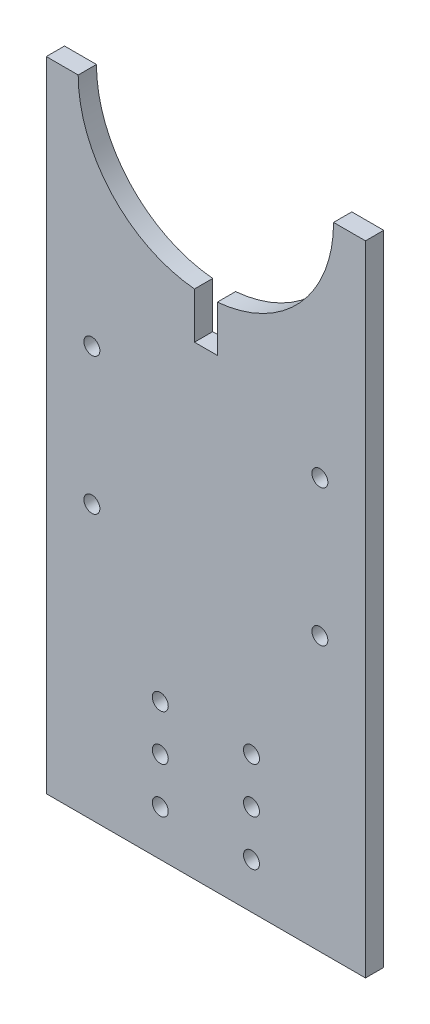
ISO-10303-21;
HEADER;
FILE_DESCRIPTION(('STEP AP214'),'2;1');
FILE_NAME('part.step','',(''),(''),'','','');
FILE_SCHEMA(('AUTOMOTIVE_DESIGN { 1 0 10303 214 1 1 1 1 }'));
ENDSEC;
DATA;
#1=APPLICATION_CONTEXT('core data for automotive mechanical design processes');
#2=APPLICATION_PROTOCOL_DEFINITION('international standard','automotive_design',2000,#1);
#3=PRODUCT_CONTEXT('',#1,'mechanical');
#4=PRODUCT('Part','Part','',(#3));
#5=PRODUCT_RELATED_PRODUCT_CATEGORY('part','',(#4));
#6=PRODUCT_DEFINITION_FORMATION('','',#4);
#7=PRODUCT_DEFINITION_CONTEXT('part definition',#1,'design');
#8=PRODUCT_DEFINITION('design','',#6,#7);
#9=PRODUCT_DEFINITION_SHAPE('','',#8);
#10=(LENGTH_UNIT() NAMED_UNIT(*) SI_UNIT(.MILLI.,.METRE.));
#11=(NAMED_UNIT(*) PLANE_ANGLE_UNIT() SI_UNIT($,.RADIAN.));
#12=(NAMED_UNIT(*) SI_UNIT($,.STERADIAN.) SOLID_ANGLE_UNIT());
#13=UNCERTAINTY_MEASURE_WITH_UNIT(LENGTH_MEASURE(1.E-05),#10,'distance_accuracy_value','');
#14=(GEOMETRIC_REPRESENTATION_CONTEXT(3) GLOBAL_UNCERTAINTY_ASSIGNED_CONTEXT((#13)) GLOBAL_UNIT_ASSIGNED_CONTEXT((#10,
#11,#12)) REPRESENTATION_CONTEXT('',''));
#15=CARTESIAN_POINT('',(0.,0.,0.));
#16=DIRECTION('',(0.,0.,1.));
#17=DIRECTION('',(1.,0.,0.));
#18=AXIS2_PLACEMENT_3D('',#15,#16,#17);
#19=CARTESIAN_POINT('',(0.,140.,0.));
#20=DIRECTION('',(0.,0.,1.));
#21=DIRECTION('',(1.,0.,0.));
#22=AXIS2_PLACEMENT_3D('',#19,#20,#21);
#23=PLANE('',#22);
#24=CARTESIAN_POINT('',(25.,90.,0.));
#25=DIRECTION('',(0.,0.,-1.));
#26=DIRECTION('',(-1.,0.,0.));
#27=AXIS2_PLACEMENT_3D('',#24,#25,#26);
#28=CIRCLE('',#27,1.75);
#29=CARTESIAN_POINT('',(23.25,90.,0.));
#30=VERTEX_POINT('',#29);
#31=EDGE_CURVE('E401',#30,#30,#28,.T.);
#32=ORIENTED_EDGE('',*,*,#31,.F.);
#33=EDGE_LOOP('',(#32));
#34=FACE_BOUND('',#33,.T.);
#35=CARTESIAN_POINT('',(-25.,90.,0.));
#36=DIRECTION('',(0.,0.,-1.));
#37=DIRECTION('',(-1.,0.,0.));
#38=AXIS2_PLACEMENT_3D('',#35,#36,#37);
#39=CIRCLE('',#38,1.75);
#40=CARTESIAN_POINT('',(-26.75,90.,0.));
#41=VERTEX_POINT('',#40);
#42=EDGE_CURVE('E393',#41,#41,#39,.T.);
#43=ORIENTED_EDGE('',*,*,#42,.F.);
#44=EDGE_LOOP('',(#43));
#45=FACE_BOUND('',#44,.T.);
#46=CARTESIAN_POINT('',(10.,30.,0.));
#47=DIRECTION('',(0.,0.,1.));
#48=DIRECTION('',(1.,0.,0.));
#49=AXIS2_PLACEMENT_3D('',#46,#47,#48);
#50=CIRCLE('',#49,1.75);
#51=CARTESIAN_POINT('',(11.75,30.,0.));
#52=VERTEX_POINT('',#51);
#53=EDGE_CURVE('E217',#52,#52,#50,.T.);
#54=ORIENTED_EDGE('',*,*,#53,.T.);
#55=EDGE_LOOP('',(#54));
#56=FACE_BOUND('',#55,.T.);
#57=CARTESIAN_POINT('',(-10.,30.,0.));
#58=DIRECTION('',(0.,0.,1.));
#59=DIRECTION('',(1.,0.,0.));
#60=AXIS2_PLACEMENT_3D('',#57,#58,#59);
#61=CIRCLE('',#60,1.75);
#62=CARTESIAN_POINT('',(-8.25,30.,0.));
#63=VERTEX_POINT('',#62);
#64=EDGE_CURVE('E225',#63,#63,#61,.T.);
#65=ORIENTED_EDGE('',*,*,#64,.T.);
#66=EDGE_LOOP('',(#65));
#67=FACE_BOUND('',#66,.T.);
#68=CARTESIAN_POINT('',(10.,20.,0.));
#69=DIRECTION('',(0.,0.,1.));
#70=DIRECTION('',(1.,0.,0.));
#71=AXIS2_PLACEMENT_3D('',#68,#69,#70);
#72=CIRCLE('',#71,1.75);
#73=CARTESIAN_POINT('',(11.75,20.,0.));
#74=VERTEX_POINT('',#73);
#75=EDGE_CURVE('E233',#74,#74,#72,.T.);
#76=ORIENTED_EDGE('',*,*,#75,.T.);
#77=EDGE_LOOP('',(#76));
#78=FACE_BOUND('',#77,.T.);
#79=CARTESIAN_POINT('',(-10.,10.,0.));
#80=DIRECTION('',(0.,0.,1.));
#81=DIRECTION('',(1.,0.,0.));
#82=AXIS2_PLACEMENT_3D('',#79,#80,#81);
#83=CIRCLE('',#82,1.75);
#84=CARTESIAN_POINT('',(-8.25,10.,0.));
#85=VERTEX_POINT('',#84);
#86=EDGE_CURVE('E241',#85,#85,#83,.T.);
#87=ORIENTED_EDGE('',*,*,#86,.T.);
#88=EDGE_LOOP('',(#87));
#89=FACE_BOUND('',#88,.T.);
#90=CARTESIAN_POINT('',(-10.,20.,0.));
#91=DIRECTION('',(0.,0.,1.));
#92=DIRECTION('',(1.,0.,0.));
#93=AXIS2_PLACEMENT_3D('',#90,#91,#92);
#94=CIRCLE('',#93,1.75);
#95=CARTESIAN_POINT('',(-8.25,20.,0.));
#96=VERTEX_POINT('',#95);
#97=EDGE_CURVE('E249',#96,#96,#94,.T.);
#98=ORIENTED_EDGE('',*,*,#97,.T.);
#99=EDGE_LOOP('',(#98));
#100=FACE_BOUND('',#99,.T.);
#101=CARTESIAN_POINT('',(10.,10.,0.));
#102=DIRECTION('',(0.,0.,1.));
#103=DIRECTION('',(1.,0.,0.));
#104=AXIS2_PLACEMENT_3D('',#101,#102,#103);
#105=CIRCLE('',#104,1.75);
#106=CARTESIAN_POINT('',(11.75,10.,0.));
#107=VERTEX_POINT('',#106);
#108=EDGE_CURVE('E257',#107,#107,#105,.T.);
#109=ORIENTED_EDGE('',*,*,#108,.T.);
#110=EDGE_LOOP('',(#109));
#111=FACE_BOUND('',#110,.T.);
#112=CARTESIAN_POINT('',(25.,60.,0.));
#113=DIRECTION('',(0.,0.,1.));
#114=DIRECTION('',(1.,0.,0.));
#115=AXIS2_PLACEMENT_3D('',#112,#113,#114);
#116=CIRCLE('',#115,1.75);
#117=CARTESIAN_POINT('',(26.75,60.,0.));
#118=VERTEX_POINT('',#117);
#119=EDGE_CURVE('E265',#118,#118,#116,.T.);
#120=ORIENTED_EDGE('',*,*,#119,.T.);
#121=EDGE_LOOP('',(#120));
#122=FACE_BOUND('',#121,.T.);
#123=CARTESIAN_POINT('',(-25.,60.,0.));
#124=DIRECTION('',(0.,0.,1.));
#125=DIRECTION('',(1.,0.,0.));
#126=AXIS2_PLACEMENT_3D('',#123,#124,#125);
#127=CIRCLE('',#126,1.75);
#128=CARTESIAN_POINT('',(-23.25,60.,0.));
#129=VERTEX_POINT('',#128);
#130=EDGE_CURVE('E273',#129,#129,#127,.T.);
#131=ORIENTED_EDGE('',*,*,#130,.T.);
#132=EDGE_LOOP('',(#131));
#133=FACE_BOUND('',#132,.T.);
#134=DIRECTION('',(-1.,0.,0.));
#135=VECTOR('',#134,1.);
#136=CARTESIAN_POINT('',(2.5,102.,0.));
#137=LINE('',#136,#135);
#138=CARTESIAN_POINT('',(2.5,102.,0.));
#139=VERTEX_POINT('',#138);
#140=CARTESIAN_POINT('',(-2.5,102.,0.));
#141=VERTEX_POINT('',#140);
#142=EDGE_CURVE('E208',#139,#141,#137,.T.);
#143=ORIENTED_EDGE('',*,*,#142,.F.);
#144=DIRECTION('',(0.,-1.,0.));
#145=VECTOR('',#144,1.);
#146=CARTESIAN_POINT('',(2.5,140.,0.));
#147=LINE('',#146,#145);
#148=CARTESIAN_POINT('',(2.5,112.111830465231,0.));
#149=VERTEX_POINT('',#148);
#150=EDGE_CURVE('E191',#149,#139,#147,.T.);
#151=ORIENTED_EDGE('',*,*,#150,.F.);
#152=CARTESIAN_POINT('',(0.,140.,0.));
#153=DIRECTION('',(0.,0.,-1.));
#154=DIRECTION('',(1.,0.,0.));
#155=AXIS2_PLACEMENT_3D('',#152,#153,#154);
#156=CIRCLE('',#155,28.);
#157=CARTESIAN_POINT('',(28.,140.,0.));
#158=VERTEX_POINT('',#157);
#159=EDGE_CURVE('E321',#158,#149,#156,.T.);
#160=ORIENTED_EDGE('',*,*,#159,.F.);
#161=DIRECTION('',(-1.,0.,0.));
#162=VECTOR('',#161,1.);
#163=CARTESIAN_POINT('',(28.,140.,0.));
#164=LINE('',#163,#162);
#165=CARTESIAN_POINT('',(35.,140.,0.));
#166=VERTEX_POINT('',#165);
#167=EDGE_CURVE('E317',#166,#158,#164,.T.);
#168=ORIENTED_EDGE('',*,*,#167,.F.);
#169=DIRECTION('',(0.,1.,0.));
#170=VECTOR('',#169,1.);
#171=CARTESIAN_POINT('',(35.,0.,0.));
#172=LINE('',#171,#170);
#173=CARTESIAN_POINT('',(35.,0.,0.));
#174=VERTEX_POINT('',#173);
#175=EDGE_CURVE('E314',#174,#166,#172,.T.);
#176=ORIENTED_EDGE('',*,*,#175,.F.);
#177=DIRECTION('',(1.,0.,0.));
#178=VECTOR('',#177,1.);
#179=CARTESIAN_POINT('',(-35.,0.,0.));
#180=LINE('',#179,#178);
#181=CARTESIAN_POINT('',(-35.,0.,0.));
#182=VERTEX_POINT('',#181);
#183=EDGE_CURVE('E311',#182,#174,#180,.T.);
#184=ORIENTED_EDGE('',*,*,#183,.F.);
#185=DIRECTION('',(0.,-1.,0.));
#186=VECTOR('',#185,1.);
#187=CARTESIAN_POINT('',(-35.,0.,0.));
#188=LINE('',#187,#186);
#189=CARTESIAN_POINT('',(-35.,140.,0.));
#190=VERTEX_POINT('',#189);
#191=EDGE_CURVE('E281',#190,#182,#188,.T.);
#192=ORIENTED_EDGE('',*,*,#191,.F.);
#193=DIRECTION('',(-1.,0.,0.));
#194=VECTOR('',#193,1.);
#195=CARTESIAN_POINT('',(-35.,140.,0.));
#196=LINE('',#195,#194);
#197=CARTESIAN_POINT('',(-28.,140.,0.));
#198=VERTEX_POINT('',#197);
#199=EDGE_CURVE('E290',#198,#190,#196,.T.);
#200=ORIENTED_EDGE('',*,*,#199,.F.);
#201=CARTESIAN_POINT('',(-2.5,112.111830465231,0.));
#202=VERTEX_POINT('',#201);
#203=EDGE_CURVE('E320',#202,#198,#156,.T.);
#204=ORIENTED_EDGE('',*,*,#203,.F.);
#205=DIRECTION('',(0.,1.,0.));
#206=VECTOR('',#205,1.);
#207=CARTESIAN_POINT('',(-2.5,140.,0.));
#208=LINE('',#207,#206);
#209=EDGE_CURVE('E197',#141,#202,#208,.T.);
#210=ORIENTED_EDGE('',*,*,#209,.F.);
#211=EDGE_LOOP('',(#143,#151,#160,#168,#176,#184,#192,#200,#204,#210));
#212=FACE_BOUND('',#211,.T.);
#213=DIRECTION('',(0.,-1.,0.));
#214=VECTOR('',#213,1.);
#215=CARTESIAN_POINT('',(4.,20.5,0.));
#216=LINE('',#215,#214);
#217=CARTESIAN_POINT('',(4.,97.,0.));
#218=VERTEX_POINT('',#217);
#219=CARTESIAN_POINT('',(4.,20.5,0.));
#220=VERTEX_POINT('',#219);
#221=EDGE_CURVE('E173',#218,#220,#216,.T.);
#222=ORIENTED_EDGE('',*,*,#221,.F.);
#223=DIRECTION('',(1.,0.,0.));
#224=VECTOR('',#223,1.);
#225=CARTESIAN_POINT('',(4.,97.,0.));
#226=LINE('',#225,#224);
#227=CARTESIAN_POINT('',(-4.,97.,0.));
#228=VERTEX_POINT('',#227);
#229=EDGE_CURVE('E168',#228,#218,#226,.T.);
#230=ORIENTED_EDGE('',*,*,#229,.F.);
#231=DIRECTION('',(0.,1.,0.));
#232=VECTOR('',#231,1.);
#233=CARTESIAN_POINT('',(-4.,20.5,0.));
#234=LINE('',#233,#232);
#235=CARTESIAN_POINT('',(-4.,20.5,0.));
#236=VERTEX_POINT('',#235);
#237=EDGE_CURVE('E154',#236,#228,#234,.T.);
#238=ORIENTED_EDGE('',*,*,#237,.F.);
#239=DIRECTION('',(-1.,0.,0.));
#240=VECTOR('',#239,1.);
#241=CARTESIAN_POINT('',(4.,20.5,0.));
#242=LINE('',#241,#240);
#243=EDGE_CURVE('E165',#220,#236,#242,.T.);
#244=ORIENTED_EDGE('',*,*,#243,.F.);
#245=EDGE_LOOP('',(#222,#230,#238,#244));
#246=FACE_BOUND('',#245,.T.);
#247=ADVANCED_FACE('F39',(#34,#45,#56,#67,#78,#89,#100,#111,#122,#133,#212,#246),#23,.F.);
#248=CARTESIAN_POINT('',(0.,140.,4.));
#249=DIRECTION('',(0.,0.,-1.));
#250=DIRECTION('',(-1.,0.,0.));
#251=AXIS2_PLACEMENT_3D('',#248,#249,#250);
#252=CYLINDRICAL_SURFACE('',#251,28.);
#253=ORIENTED_EDGE('',*,*,#159,.T.);
#254=DIRECTION('',(0.,0.,-1.));
#255=VECTOR('',#254,1.);
#256=CARTESIAN_POINT('',(2.5,112.111830465231,4.));
#257=LINE('',#256,#255);
#258=CARTESIAN_POINT('',(2.5,112.111830465231,4.));
#259=VERTEX_POINT('',#258);
#260=EDGE_CURVE('E354',#149,#259,#257,.F.);
#261=ORIENTED_EDGE('',*,*,#260,.T.);
#262=CARTESIAN_POINT('',(0.,140.,4.));
#263=DIRECTION('',(0.,0.,-1.));
#264=DIRECTION('',(1.,0.,0.));
#265=AXIS2_PLACEMENT_3D('',#262,#263,#264);
#266=CIRCLE('',#265,28.);
#267=CARTESIAN_POINT('',(28.,140.,4.));
#268=VERTEX_POINT('',#267);
#269=EDGE_CURVE('E300',#268,#259,#266,.T.);
#270=ORIENTED_EDGE('',*,*,#269,.F.);
#271=DIRECTION('',(0.,0.,-1.));
#272=VECTOR('',#271,1.);
#273=CARTESIAN_POINT('',(28.,140.,4.));
#274=LINE('',#273,#272);
#275=EDGE_CURVE('E334',#268,#158,#274,.T.);
#276=ORIENTED_EDGE('',*,*,#275,.T.);
#277=EDGE_LOOP('',(#253,#261,#270,#276));
#278=FACE_BOUND('',#277,.T.);
#279=ADVANCED_FACE('F421',(#278),#252,.F.);
#280=CARTESIAN_POINT('',(0.,140.,4.));
#281=DIRECTION('',(0.,0.,1.));
#282=DIRECTION('',(1.,0.,0.));
#283=AXIS2_PLACEMENT_3D('',#280,#281,#282);
#284=PLANE('',#283);
#285=CARTESIAN_POINT('',(25.,90.,4.));
#286=DIRECTION('',(0.,0.,-1.));
#287=DIRECTION('',(-1.,0.,0.));
#288=AXIS2_PLACEMENT_3D('',#285,#286,#287);
#289=CIRCLE('',#288,1.75);
#290=CARTESIAN_POINT('',(23.25,90.,4.));
#291=VERTEX_POINT('',#290);
#292=EDGE_CURVE('E176',#291,#291,#289,.T.);
#293=ORIENTED_EDGE('',*,*,#292,.T.);
#294=EDGE_LOOP('',(#293));
#295=FACE_BOUND('',#294,.T.);
#296=CARTESIAN_POINT('',(-25.,90.,4.));
#297=DIRECTION('',(0.,0.,-1.));
#298=DIRECTION('',(-1.,0.,0.));
#299=AXIS2_PLACEMENT_3D('',#296,#297,#298);
#300=CIRCLE('',#299,1.75);
#301=CARTESIAN_POINT('',(-26.75,90.,4.));
#302=VERTEX_POINT('',#301);
#303=EDGE_CURVE('E397',#302,#302,#300,.T.);
#304=ORIENTED_EDGE('',*,*,#303,.T.);
#305=EDGE_LOOP('',(#304));
#306=FACE_BOUND('',#305,.T.);
#307=DIRECTION('',(0.,-1.,0.));
#308=VECTOR('',#307,1.);
#309=CARTESIAN_POINT('',(2.5,140.,4.));
#310=LINE('',#309,#308);
#311=CARTESIAN_POINT('',(2.5,102.,4.));
#312=VERTEX_POINT('',#311);
#313=EDGE_CURVE('E192',#259,#312,#310,.T.);
#314=ORIENTED_EDGE('',*,*,#313,.T.);
#315=DIRECTION('',(-1.,0.,0.));
#316=VECTOR('',#315,1.);
#317=CARTESIAN_POINT('',(2.5,102.,4.));
#318=LINE('',#317,#316);
#319=CARTESIAN_POINT('',(-2.5,102.,4.));
#320=VERTEX_POINT('',#319);
#321=EDGE_CURVE('E196',#312,#320,#318,.T.);
#322=ORIENTED_EDGE('',*,*,#321,.T.);
#323=DIRECTION('',(0.,1.,0.));
#324=VECTOR('',#323,1.);
#325=CARTESIAN_POINT('',(-2.5,140.,4.));
#326=LINE('',#325,#324);
#327=CARTESIAN_POINT('',(-2.5,112.111830465231,4.));
#328=VERTEX_POINT('',#327);
#329=EDGE_CURVE('E201',#320,#328,#326,.T.);
#330=ORIENTED_EDGE('',*,*,#329,.T.);
#331=CARTESIAN_POINT('',(-28.,140.,4.));
#332=VERTEX_POINT('',#331);
#333=EDGE_CURVE('E299',#328,#332,#266,.T.);
#334=ORIENTED_EDGE('',*,*,#333,.T.);
#335=DIRECTION('',(-1.,0.,0.));
#336=VECTOR('',#335,1.);
#337=CARTESIAN_POINT('',(-35.,140.,4.));
#338=LINE('',#337,#336);
#339=CARTESIAN_POINT('',(-35.,140.,4.));
#340=VERTEX_POINT('',#339);
#341=EDGE_CURVE('E304',#332,#340,#338,.T.);
#342=ORIENTED_EDGE('',*,*,#341,.T.);
#343=DIRECTION('',(0.,-1.,0.));
#344=VECTOR('',#343,1.);
#345=CARTESIAN_POINT('',(-35.,0.,4.));
#346=LINE('',#345,#344);
#347=CARTESIAN_POINT('',(-35.,0.,4.));
#348=VERTEX_POINT('',#347);
#349=EDGE_CURVE('E285',#340,#348,#346,.T.);
#350=ORIENTED_EDGE('',*,*,#349,.T.);
#351=DIRECTION('',(1.,0.,0.));
#352=VECTOR('',#351,1.);
#353=CARTESIAN_POINT('',(-35.,0.,4.));
#354=LINE('',#353,#352);
#355=CARTESIAN_POINT('',(35.,0.,4.));
#356=VERTEX_POINT('',#355);
#357=EDGE_CURVE('E289',#348,#356,#354,.T.);
#358=ORIENTED_EDGE('',*,*,#357,.T.);
#359=DIRECTION('',(0.,1.,0.));
#360=VECTOR('',#359,1.);
#361=CARTESIAN_POINT('',(35.,0.,4.));
#362=LINE('',#361,#360);
#363=CARTESIAN_POINT('',(35.,140.,4.));
#364=VERTEX_POINT('',#363);
#365=EDGE_CURVE('E293',#356,#364,#362,.T.);
#366=ORIENTED_EDGE('',*,*,#365,.T.);
#367=DIRECTION('',(-1.,0.,0.));
#368=VECTOR('',#367,1.);
#369=CARTESIAN_POINT('',(28.,140.,4.));
#370=LINE('',#369,#368);
#371=EDGE_CURVE('E296',#364,#268,#370,.T.);
#372=ORIENTED_EDGE('',*,*,#371,.T.);
#373=ORIENTED_EDGE('',*,*,#269,.T.);
#374=EDGE_LOOP('',(#314,#322,#330,#334,#342,#350,#358,#366,#372,#373));
#375=FACE_BOUND('',#374,.T.);
#376=CARTESIAN_POINT('',(-10.,30.,4.));
#377=DIRECTION('',(0.,0.,1.));
#378=DIRECTION('',(1.,0.,0.));
#379=AXIS2_PLACEMENT_3D('',#376,#377,#378);
#380=CIRCLE('',#379,1.75);
#381=CARTESIAN_POINT('',(-8.25,30.,4.));
#382=VERTEX_POINT('',#381);
#383=EDGE_CURVE('E229',#382,#382,#380,.T.);
#384=ORIENTED_EDGE('',*,*,#383,.F.);
#385=EDGE_LOOP('',(#384));
#386=FACE_BOUND('',#385,.T.);
#387=CARTESIAN_POINT('',(-10.,10.,4.));
#388=DIRECTION('',(0.,0.,1.));
#389=DIRECTION('',(1.,0.,0.));
#390=AXIS2_PLACEMENT_3D('',#387,#388,#389);
#391=CIRCLE('',#390,1.75);
#392=CARTESIAN_POINT('',(-8.25,10.,4.));
#393=VERTEX_POINT('',#392);
#394=EDGE_CURVE('E245',#393,#393,#391,.T.);
#395=ORIENTED_EDGE('',*,*,#394,.F.);
#396=EDGE_LOOP('',(#395));
#397=FACE_BOUND('',#396,.T.);
#398=CARTESIAN_POINT('',(10.,10.,4.));
#399=DIRECTION('',(0.,0.,1.));
#400=DIRECTION('',(1.,0.,0.));
#401=AXIS2_PLACEMENT_3D('',#398,#399,#400);
#402=CIRCLE('',#401,1.75);
#403=CARTESIAN_POINT('',(11.75,10.,4.));
#404=VERTEX_POINT('',#403);
#405=EDGE_CURVE('E261',#404,#404,#402,.T.);
#406=ORIENTED_EDGE('',*,*,#405,.F.);
#407=EDGE_LOOP('',(#406));
#408=FACE_BOUND('',#407,.T.);
#409=CARTESIAN_POINT('',(-25.,60.,4.));
#410=DIRECTION('',(0.,0.,1.));
#411=DIRECTION('',(1.,0.,0.));
#412=AXIS2_PLACEMENT_3D('',#409,#410,#411);
#413=CIRCLE('',#412,1.75);
#414=CARTESIAN_POINT('',(-23.25,60.,4.));
#415=VERTEX_POINT('',#414);
#416=EDGE_CURVE('E277',#415,#415,#413,.T.);
#417=ORIENTED_EDGE('',*,*,#416,.F.);
#418=EDGE_LOOP('',(#417));
#419=FACE_BOUND('',#418,.T.);
#420=CARTESIAN_POINT('',(25.,60.,4.));
#421=DIRECTION('',(0.,0.,1.));
#422=DIRECTION('',(1.,0.,0.));
#423=AXIS2_PLACEMENT_3D('',#420,#421,#422);
#424=CIRCLE('',#423,1.75);
#425=CARTESIAN_POINT('',(26.75,60.,4.));
#426=VERTEX_POINT('',#425);
#427=EDGE_CURVE('E269',#426,#426,#424,.T.);
#428=ORIENTED_EDGE('',*,*,#427,.F.);
#429=EDGE_LOOP('',(#428));
#430=FACE_BOUND('',#429,.T.);
#431=CARTESIAN_POINT('',(-10.,20.,4.));
#432=DIRECTION('',(0.,0.,1.));
#433=DIRECTION('',(1.,0.,0.));
#434=AXIS2_PLACEMENT_3D('',#431,#432,#433);
#435=CIRCLE('',#434,1.75);
#436=CARTESIAN_POINT('',(-8.25,20.,4.));
#437=VERTEX_POINT('',#436);
#438=EDGE_CURVE('E253',#437,#437,#435,.T.);
#439=ORIENTED_EDGE('',*,*,#438,.F.);
#440=EDGE_LOOP('',(#439));
#441=FACE_BOUND('',#440,.T.);
#442=CARTESIAN_POINT('',(10.,20.,4.));
#443=DIRECTION('',(0.,0.,1.));
#444=DIRECTION('',(1.,0.,0.));
#445=AXIS2_PLACEMENT_3D('',#442,#443,#444);
#446=CIRCLE('',#445,1.75);
#447=CARTESIAN_POINT('',(11.75,20.,4.));
#448=VERTEX_POINT('',#447);
#449=EDGE_CURVE('E237',#448,#448,#446,.T.);
#450=ORIENTED_EDGE('',*,*,#449,.F.);
#451=EDGE_LOOP('',(#450));
#452=FACE_BOUND('',#451,.T.);
#453=CARTESIAN_POINT('',(10.,30.,4.));
#454=DIRECTION('',(0.,0.,1.));
#455=DIRECTION('',(1.,0.,0.));
#456=AXIS2_PLACEMENT_3D('',#453,#454,#455);
#457=CIRCLE('',#456,1.75);
#458=CARTESIAN_POINT('',(11.75,30.,4.));
#459=VERTEX_POINT('',#458);
#460=EDGE_CURVE('E221',#459,#459,#457,.T.);
#461=ORIENTED_EDGE('',*,*,#460,.F.);
#462=EDGE_LOOP('',(#461));
#463=FACE_BOUND('',#462,.T.);
#464=ADVANCED_FACE('F409',(#295,#306,#375,#386,#397,#408,#419,#430,#441,#452,#463),#284,.T.);
#465=CARTESIAN_POINT('',(-35.,0.,4.));
#466=DIRECTION('',(1.,0.,0.));
#467=DIRECTION('',(0.,0.,-1.));
#468=AXIS2_PLACEMENT_3D('',#465,#466,#467);
#469=PLANE('',#468);
#470=ORIENTED_EDGE('',*,*,#191,.T.);
#471=DIRECTION('',(0.,0.,-1.));
#472=VECTOR('',#471,1.);
#473=CARTESIAN_POINT('',(-35.,0.,4.));
#474=LINE('',#473,#472);
#475=EDGE_CURVE('E346',#348,#182,#474,.T.);
#476=ORIENTED_EDGE('',*,*,#475,.F.);
#477=ORIENTED_EDGE('',*,*,#349,.F.);
#478=DIRECTION('',(0.,0.,-1.));
#479=VECTOR('',#478,1.);
#480=CARTESIAN_POINT('',(-35.,140.,4.));
#481=LINE('',#480,#479);
#482=EDGE_CURVE('E307',#340,#190,#481,.T.);
#483=ORIENTED_EDGE('',*,*,#482,.T.);
#484=EDGE_LOOP('',(#470,#476,#477,#483));
#485=FACE_BOUND('',#484,.T.);
#486=ADVANCED_FACE('F473',(#485),#469,.F.);
#487=CARTESIAN_POINT('',(-35.,0.,4.));
#488=DIRECTION('',(0.,1.,0.));
#489=DIRECTION('',(0.,0.,1.));
#490=AXIS2_PLACEMENT_3D('',#487,#488,#489);
#491=PLANE('',#490);
#492=ORIENTED_EDGE('',*,*,#183,.T.);
#493=DIRECTION('',(0.,0.,-1.));
#494=VECTOR('',#493,1.);
#495=CARTESIAN_POINT('',(35.,0.,4.));
#496=LINE('',#495,#494);
#497=EDGE_CURVE('E342',#356,#174,#496,.T.);
#498=ORIENTED_EDGE('',*,*,#497,.F.);
#499=ORIENTED_EDGE('',*,*,#357,.F.);
#500=ORIENTED_EDGE('',*,*,#475,.T.);
#501=EDGE_LOOP('',(#492,#498,#499,#500));
#502=FACE_BOUND('',#501,.T.);
#503=ADVANCED_FACE('F469',(#502),#491,.F.);
#504=CARTESIAN_POINT('',(35.,0.,4.));
#505=DIRECTION('',(-1.,0.,0.));
#506=DIRECTION('',(0.,0.,1.));
#507=AXIS2_PLACEMENT_3D('',#504,#505,#506);
#508=PLANE('',#507);
#509=ORIENTED_EDGE('',*,*,#175,.T.);
#510=DIRECTION('',(0.,0.,-1.));
#511=VECTOR('',#510,1.);
#512=CARTESIAN_POINT('',(35.,140.,4.));
#513=LINE('',#512,#511);
#514=EDGE_CURVE('E338',#364,#166,#513,.T.);
#515=ORIENTED_EDGE('',*,*,#514,.F.);
#516=ORIENTED_EDGE('',*,*,#365,.F.);
#517=ORIENTED_EDGE('',*,*,#497,.T.);
#518=EDGE_LOOP('',(#509,#515,#516,#517));
#519=FACE_BOUND('',#518,.T.);
#520=ADVANCED_FACE('F466',(#519),#508,.F.);
#521=CARTESIAN_POINT('',(28.,140.,4.));
#522=DIRECTION('',(0.,-1.,0.));
#523=DIRECTION('',(0.,0.,-1.));
#524=AXIS2_PLACEMENT_3D('',#521,#522,#523);
#525=PLANE('',#524);
#526=ORIENTED_EDGE('',*,*,#167,.T.);
#527=ORIENTED_EDGE('',*,*,#275,.F.);
#528=ORIENTED_EDGE('',*,*,#371,.F.);
#529=ORIENTED_EDGE('',*,*,#514,.T.);
#530=EDGE_LOOP('',(#526,#527,#528,#529));
#531=FACE_BOUND('',#530,.T.);
#532=ADVANCED_FACE('F461',(#531),#525,.F.);
#533=ORIENTED_EDGE('',*,*,#333,.F.);
#534=DIRECTION('',(0.,0.,-1.));
#535=VECTOR('',#534,1.);
#536=CARTESIAN_POINT('',(-2.5,112.111830465231,4.));
#537=LINE('',#536,#535);
#538=EDGE_CURVE('E350',#328,#202,#537,.T.);
#539=ORIENTED_EDGE('',*,*,#538,.T.);
#540=ORIENTED_EDGE('',*,*,#203,.T.);
#541=DIRECTION('',(0.,0.,-1.));
#542=VECTOR('',#541,1.);
#543=CARTESIAN_POINT('',(-28.,140.,4.));
#544=LINE('',#543,#542);
#545=EDGE_CURVE('E330',#332,#198,#544,.T.);
#546=ORIENTED_EDGE('',*,*,#545,.F.);
#547=EDGE_LOOP('',(#533,#539,#540,#546));
#548=FACE_BOUND('',#547,.T.);
#549=ADVANCED_FACE('F482',(#548),#252,.F.);
#550=CARTESIAN_POINT('',(-35.,140.,4.));
#551=DIRECTION('',(0.,-1.,0.));
#552=DIRECTION('',(0.,0.,-1.));
#553=AXIS2_PLACEMENT_3D('',#550,#551,#552);
#554=PLANE('',#553);
#555=ORIENTED_EDGE('',*,*,#199,.T.);
#556=ORIENTED_EDGE('',*,*,#482,.F.);
#557=ORIENTED_EDGE('',*,*,#341,.F.);
#558=ORIENTED_EDGE('',*,*,#545,.T.);
#559=EDGE_LOOP('',(#555,#556,#557,#558));
#560=FACE_BOUND('',#559,.T.);
#561=ADVANCED_FACE('F477',(#560),#554,.F.);
#562=CARTESIAN_POINT('',(-25.,60.,4.));
#563=DIRECTION('',(0.,0.,-1.));
#564=DIRECTION('',(-1.,0.,0.));
#565=AXIS2_PLACEMENT_3D('',#562,#563,#564);
#566=CYLINDRICAL_SURFACE('',#565,1.75);
#567=ORIENTED_EDGE('',*,*,#416,.T.);
#568=EDGE_LOOP('',(#567));
#569=FACE_BOUND('',#568,.T.);
#570=ORIENTED_EDGE('',*,*,#130,.F.);
#571=EDGE_LOOP('',(#570));
#572=FACE_BOUND('',#571,.T.);
#573=ADVANCED_FACE('F526',(#569,#572),#566,.F.);
#574=CARTESIAN_POINT('',(25.,60.,4.));
#575=DIRECTION('',(0.,0.,-1.));
#576=DIRECTION('',(-1.,0.,0.));
#577=AXIS2_PLACEMENT_3D('',#574,#575,#576);
#578=CYLINDRICAL_SURFACE('',#577,1.75);
#579=ORIENTED_EDGE('',*,*,#427,.T.);
#580=EDGE_LOOP('',(#579));
#581=FACE_BOUND('',#580,.T.);
#582=ORIENTED_EDGE('',*,*,#119,.F.);
#583=EDGE_LOOP('',(#582));
#584=FACE_BOUND('',#583,.T.);
#585=ADVANCED_FACE('F522',(#581,#584),#578,.F.);
#586=CARTESIAN_POINT('',(10.,10.,4.));
#587=DIRECTION('',(0.,0.,-1.));
#588=DIRECTION('',(-1.,0.,0.));
#589=AXIS2_PLACEMENT_3D('',#586,#587,#588);
#590=CYLINDRICAL_SURFACE('',#589,1.75);
#591=ORIENTED_EDGE('',*,*,#405,.T.);
#592=EDGE_LOOP('',(#591));
#593=FACE_BOUND('',#592,.T.);
#594=ORIENTED_EDGE('',*,*,#108,.F.);
#595=EDGE_LOOP('',(#594));
#596=FACE_BOUND('',#595,.T.);
#597=ADVANCED_FACE('F518',(#593,#596),#590,.F.);
#598=CARTESIAN_POINT('',(-10.,20.,4.));
#599=DIRECTION('',(0.,0.,-1.));
#600=DIRECTION('',(-1.,0.,0.));
#601=AXIS2_PLACEMENT_3D('',#598,#599,#600);
#602=CYLINDRICAL_SURFACE('',#601,1.75);
#603=ORIENTED_EDGE('',*,*,#438,.T.);
#604=EDGE_LOOP('',(#603));
#605=FACE_BOUND('',#604,.T.);
#606=ORIENTED_EDGE('',*,*,#97,.F.);
#607=EDGE_LOOP('',(#606));
#608=FACE_BOUND('',#607,.T.);
#609=ADVANCED_FACE('F514',(#605,#608),#602,.F.);
#610=CARTESIAN_POINT('',(-10.,10.,4.));
#611=DIRECTION('',(0.,0.,-1.));
#612=DIRECTION('',(-1.,0.,0.));
#613=AXIS2_PLACEMENT_3D('',#610,#611,#612);
#614=CYLINDRICAL_SURFACE('',#613,1.75);
#615=ORIENTED_EDGE('',*,*,#394,.T.);
#616=EDGE_LOOP('',(#615));
#617=FACE_BOUND('',#616,.T.);
#618=ORIENTED_EDGE('',*,*,#86,.F.);
#619=EDGE_LOOP('',(#618));
#620=FACE_BOUND('',#619,.T.);
#621=ADVANCED_FACE('F510',(#617,#620),#614,.F.);
#622=CARTESIAN_POINT('',(10.,20.,4.));
#623=DIRECTION('',(0.,0.,-1.));
#624=DIRECTION('',(-1.,0.,0.));
#625=AXIS2_PLACEMENT_3D('',#622,#623,#624);
#626=CYLINDRICAL_SURFACE('',#625,1.75);
#627=ORIENTED_EDGE('',*,*,#449,.T.);
#628=EDGE_LOOP('',(#627));
#629=FACE_BOUND('',#628,.T.);
#630=ORIENTED_EDGE('',*,*,#75,.F.);
#631=EDGE_LOOP('',(#630));
#632=FACE_BOUND('',#631,.T.);
#633=ADVANCED_FACE('F506',(#629,#632),#626,.F.);
#634=CARTESIAN_POINT('',(-10.,30.,4.));
#635=DIRECTION('',(0.,0.,-1.));
#636=DIRECTION('',(-1.,0.,0.));
#637=AXIS2_PLACEMENT_3D('',#634,#635,#636);
#638=CYLINDRICAL_SURFACE('',#637,1.75);
#639=ORIENTED_EDGE('',*,*,#383,.T.);
#640=EDGE_LOOP('',(#639));
#641=FACE_BOUND('',#640,.T.);
#642=ORIENTED_EDGE('',*,*,#64,.F.);
#643=EDGE_LOOP('',(#642));
#644=FACE_BOUND('',#643,.T.);
#645=ADVANCED_FACE('F502',(#641,#644),#638,.F.);
#646=CARTESIAN_POINT('',(10.,30.,4.));
#647=DIRECTION('',(0.,0.,-1.));
#648=DIRECTION('',(-1.,0.,0.));
#649=AXIS2_PLACEMENT_3D('',#646,#647,#648);
#650=CYLINDRICAL_SURFACE('',#649,1.75);
#651=ORIENTED_EDGE('',*,*,#460,.T.);
#652=EDGE_LOOP('',(#651));
#653=FACE_BOUND('',#652,.T.);
#654=ORIENTED_EDGE('',*,*,#53,.F.);
#655=EDGE_LOOP('',(#654));
#656=FACE_BOUND('',#655,.T.);
#657=ADVANCED_FACE('F495',(#653,#656),#650,.F.);
#658=CARTESIAN_POINT('',(2.5,140.,4.));
#659=DIRECTION('',(1.,0.,0.));
#660=DIRECTION('',(0.,1.,0.));
#661=AXIS2_PLACEMENT_3D('',#658,#659,#660);
#662=PLANE('',#661);
#663=ORIENTED_EDGE('',*,*,#150,.T.);
#664=DIRECTION('',(0.,0.,-1.));
#665=VECTOR('',#664,1.);
#666=CARTESIAN_POINT('',(2.5,102.,4.));
#667=LINE('',#666,#665);
#668=EDGE_CURVE('E205',#312,#139,#667,.T.);
#669=ORIENTED_EDGE('',*,*,#668,.F.);
#670=ORIENTED_EDGE('',*,*,#313,.F.);
#671=ORIENTED_EDGE('',*,*,#260,.F.);
#672=EDGE_LOOP('',(#663,#669,#670,#671));
#673=FACE_BOUND('',#672,.T.);
#674=ADVANCED_FACE('F451',(#673),#662,.F.);
#675=CARTESIAN_POINT('',(-2.5,140.,4.));
#676=DIRECTION('',(-1.,0.,0.));
#677=DIRECTION('',(0.,-1.,0.));
#678=AXIS2_PLACEMENT_3D('',#675,#676,#677);
#679=PLANE('',#678);
#680=ORIENTED_EDGE('',*,*,#329,.F.);
#681=DIRECTION('',(0.,0.,-1.));
#682=VECTOR('',#681,1.);
#683=CARTESIAN_POINT('',(-2.5,102.,4.));
#684=LINE('',#683,#682);
#685=EDGE_CURVE('E214',#320,#141,#684,.T.);
#686=ORIENTED_EDGE('',*,*,#685,.T.);
#687=ORIENTED_EDGE('',*,*,#209,.T.);
#688=ORIENTED_EDGE('',*,*,#538,.F.);
#689=EDGE_LOOP('',(#680,#686,#687,#688));
#690=FACE_BOUND('',#689,.T.);
#691=ADVANCED_FACE('F486',(#690),#679,.F.);
#692=CARTESIAN_POINT('',(2.5,102.,4.));
#693=DIRECTION('',(0.,-1.,0.));
#694=DIRECTION('',(0.,0.,-1.));
#695=AXIS2_PLACEMENT_3D('',#692,#693,#694);
#696=PLANE('',#695);
#697=ORIENTED_EDGE('',*,*,#142,.T.);
#698=ORIENTED_EDGE('',*,*,#685,.F.);
#699=ORIENTED_EDGE('',*,*,#321,.F.);
#700=ORIENTED_EDGE('',*,*,#668,.T.);
#701=EDGE_LOOP('',(#697,#698,#699,#700));
#702=FACE_BOUND('',#701,.T.);
#703=ADVANCED_FACE('F447',(#702),#696,.F.);
#704=CARTESIAN_POINT('',(4.,20.5,-5.));
#705=DIRECTION('',(-1.,0.,0.));
#706=DIRECTION('',(0.,-1.,0.));
#707=AXIS2_PLACEMENT_3D('',#704,#705,#706);
#708=PLANE('',#707);
#709=DIRECTION('',(0.,0.,1.));
#710=VECTOR('',#709,1.);
#711=CARTESIAN_POINT('',(4.,20.5,-5.));
#712=LINE('',#711,#710);
#713=CARTESIAN_POINT('',(4.,20.5,-3.));
#714=VERTEX_POINT('',#713);
#715=EDGE_CURVE('E158',#714,#220,#712,.T.);
#716=ORIENTED_EDGE('',*,*,#715,.F.);
#717=DIRECTION('',(0.,-1.,0.));
#718=VECTOR('',#717,1.);
#719=CARTESIAN_POINT('',(4.,20.5,-3.));
#720=LINE('',#719,#718);
#721=CARTESIAN_POINT('',(4.,97.,-3.));
#722=VERTEX_POINT('',#721);
#723=EDGE_CURVE('E11',#714,#722,#720,.F.);
#724=ORIENTED_EDGE('',*,*,#723,.T.);
#725=DIRECTION('',(0.,0.,1.));
#726=VECTOR('',#725,1.);
#727=CARTESIAN_POINT('',(4.,97.,-5.));
#728=LINE('',#727,#726);
#729=EDGE_CURVE('E183',#722,#218,#728,.T.);
#730=ORIENTED_EDGE('',*,*,#729,.T.);
#731=ORIENTED_EDGE('',*,*,#221,.T.);
#732=EDGE_LOOP('',(#716,#724,#730,#731));
#733=FACE_BOUND('',#732,.T.);
#734=ADVANCED_FACE('F493',(#733),#708,.F.);
#735=CARTESIAN_POINT('',(4.,20.5,-5.));
#736=DIRECTION('',(0.,1.,0.));
#737=DIRECTION('',(0.,0.,1.));
#738=AXIS2_PLACEMENT_3D('',#735,#736,#737);
#739=PLANE('',#738);
#740=DIRECTION('',(0.,0.,1.));
#741=VECTOR('',#740,1.);
#742=CARTESIAN_POINT('',(-4.,20.5,-5.));
#743=LINE('',#742,#741);
#744=CARTESIAN_POINT('',(-4.,20.5,-3.));
#745=VERTEX_POINT('',#744);
#746=EDGE_CURVE('E151',#745,#236,#743,.T.);
#747=ORIENTED_EDGE('',*,*,#746,.F.);
#748=CARTESIAN_POINT('',(-2.,20.5,-3.));
#749=DIRECTION('',(0.,1.,0.));
#750=DIRECTION('',(0.,0.,1.));
#751=AXIS2_PLACEMENT_3D('',#748,#749,#750);
#752=CIRCLE('',#751,2.);
#753=CARTESIAN_POINT('',(-2.,20.5,-5.));
#754=VERTEX_POINT('',#753);
#755=EDGE_CURVE('E48',#745,#754,#752,.F.);
#756=ORIENTED_EDGE('',*,*,#755,.T.);
#757=DIRECTION('',(-1.,0.,0.));
#758=VECTOR('',#757,1.);
#759=CARTESIAN_POINT('',(4.,20.5,-5.));
#760=LINE('',#759,#758);
#761=CARTESIAN_POINT('',(2.,20.5,-5.));
#762=VERTEX_POINT('',#761);
#763=EDGE_CURVE('E182',#762,#754,#760,.T.);
#764=ORIENTED_EDGE('',*,*,#763,.F.);
#765=CARTESIAN_POINT('',(2.,20.5,-3.));
#766=DIRECTION('',(0.,1.,0.));
#767=DIRECTION('',(0.,0.,1.));
#768=AXIS2_PLACEMENT_3D('',#765,#766,#767);
#769=CIRCLE('',#768,2.);
#770=EDGE_CURVE('E55',#762,#714,#769,.F.);
#771=ORIENTED_EDGE('',*,*,#770,.T.);
#772=ORIENTED_EDGE('',*,*,#715,.T.);
#773=ORIENTED_EDGE('',*,*,#243,.T.);
#774=EDGE_LOOP('',(#747,#756,#764,#771,#772,#773));
#775=FACE_BOUND('',#774,.T.);
#776=ADVANCED_FACE('F171',(#775),#739,.F.);
#777=CARTESIAN_POINT('',(-4.,20.5,-5.));
#778=DIRECTION('',(1.,0.,0.));
#779=DIRECTION('',(0.,1.,0.));
#780=AXIS2_PLACEMENT_3D('',#777,#778,#779);
#781=PLANE('',#780);
#782=DIRECTION('',(0.,0.,1.));
#783=VECTOR('',#782,1.);
#784=CARTESIAN_POINT('',(-4.,97.,-5.));
#785=LINE('',#784,#783);
#786=CARTESIAN_POINT('',(-4.,97.,-3.));
#787=VERTEX_POINT('',#786);
#788=EDGE_CURVE('E159',#787,#228,#785,.T.);
#789=ORIENTED_EDGE('',*,*,#788,.F.);
#790=DIRECTION('',(0.,1.,0.));
#791=VECTOR('',#790,1.);
#792=CARTESIAN_POINT('',(-4.,20.5,-3.));
#793=LINE('',#792,#791);
#794=EDGE_CURVE('E63',#787,#745,#793,.F.);
#795=ORIENTED_EDGE('',*,*,#794,.T.);
#796=ORIENTED_EDGE('',*,*,#746,.T.);
#797=ORIENTED_EDGE('',*,*,#237,.T.);
#798=EDGE_LOOP('',(#789,#795,#796,#797));
#799=FACE_BOUND('',#798,.T.);
#800=ADVANCED_FACE('F153',(#799),#781,.F.);
#801=CARTESIAN_POINT('',(4.,97.,-5.));
#802=DIRECTION('',(0.,-1.,0.));
#803=DIRECTION('',(0.,0.,-1.));
#804=AXIS2_PLACEMENT_3D('',#801,#802,#803);
#805=PLANE('',#804);
#806=DIRECTION('',(1.,0.,0.));
#807=VECTOR('',#806,1.);
#808=CARTESIAN_POINT('',(4.,97.,-5.));
#809=LINE('',#808,#807);
#810=CARTESIAN_POINT('',(-2.,97.,-5.));
#811=VERTEX_POINT('',#810);
#812=CARTESIAN_POINT('',(2.,97.,-5.));
#813=VERTEX_POINT('',#812);
#814=EDGE_CURVE('E186',#811,#813,#809,.T.);
#815=ORIENTED_EDGE('',*,*,#814,.F.);
#816=CARTESIAN_POINT('',(-2.,97.,-3.));
#817=DIRECTION('',(0.,-1.,0.));
#818=DIRECTION('',(0.,0.,-1.));
#819=AXIS2_PLACEMENT_3D('',#816,#817,#818);
#820=CIRCLE('',#819,2.);
#821=EDGE_CURVE('E369',#811,#787,#820,.F.);
#822=ORIENTED_EDGE('',*,*,#821,.T.);
#823=ORIENTED_EDGE('',*,*,#788,.T.);
#824=ORIENTED_EDGE('',*,*,#229,.T.);
#825=ORIENTED_EDGE('',*,*,#729,.F.);
#826=CARTESIAN_POINT('',(2.,97.,-3.));
#827=DIRECTION('',(0.,-1.,0.));
#828=DIRECTION('',(0.,0.,-1.));
#829=AXIS2_PLACEMENT_3D('',#826,#827,#828);
#830=CIRCLE('',#829,2.);
#831=EDGE_CURVE('E366',#722,#813,#830,.F.);
#832=ORIENTED_EDGE('',*,*,#831,.T.);
#833=EDGE_LOOP('',(#815,#822,#823,#824,#825,#832));
#834=FACE_BOUND('',#833,.T.);
#835=ADVANCED_FACE('F388',(#834),#805,.F.);
#836=CARTESIAN_POINT('',(0.,0.,-5.));
#837=DIRECTION('',(0.,0.,1.));
#838=DIRECTION('',(1.,0.,0.));
#839=AXIS2_PLACEMENT_3D('',#836,#837,#838);
#840=PLANE('',#839);
#841=ORIENTED_EDGE('',*,*,#763,.T.);
#842=DIRECTION('',(0.,1.,0.));
#843=VECTOR('',#842,1.);
#844=CARTESIAN_POINT('',(-2.,0.,-5.));
#845=LINE('',#844,#843);
#846=EDGE_CURVE('E362',#754,#811,#845,.T.);
#847=ORIENTED_EDGE('',*,*,#846,.T.);
#848=ORIENTED_EDGE('',*,*,#814,.T.);
#849=DIRECTION('',(0.,-1.,0.));
#850=VECTOR('',#849,1.);
#851=CARTESIAN_POINT('',(2.,0.,-5.));
#852=LINE('',#851,#850);
#853=EDGE_CURVE('E358',#813,#762,#852,.T.);
#854=ORIENTED_EDGE('',*,*,#853,.T.);
#855=EDGE_LOOP('',(#841,#847,#848,#854));
#856=FACE_BOUND('',#855,.T.);
#857=ADVANCED_FACE('F380',(#856),#840,.F.);
#858=CARTESIAN_POINT('',(-2.,0.,-3.));
#859=DIRECTION('',(0.,1.,0.));
#860=DIRECTION('',(-1.,0.,0.));
#861=AXIS2_PLACEMENT_3D('',#858,#859,#860);
#862=CYLINDRICAL_SURFACE('',#861,2.);
#863=ORIENTED_EDGE('',*,*,#755,.F.);
#864=ORIENTED_EDGE('',*,*,#794,.F.);
#865=ORIENTED_EDGE('',*,*,#821,.F.);
#866=ORIENTED_EDGE('',*,*,#846,.F.);
#867=EDGE_LOOP('',(#863,#864,#865,#866));
#868=FACE_BOUND('',#867,.T.);
#869=ADVANCED_FACE('F386',(#868),#862,.T.);
#870=CARTESIAN_POINT('',(2.,0.,-3.));
#871=DIRECTION('',(0.,-1.,0.));
#872=DIRECTION('',(1.,0.,0.));
#873=AXIS2_PLACEMENT_3D('',#870,#871,#872);
#874=CYLINDRICAL_SURFACE('',#873,2.);
#875=ORIENTED_EDGE('',*,*,#831,.F.);
#876=ORIENTED_EDGE('',*,*,#723,.F.);
#877=ORIENTED_EDGE('',*,*,#770,.F.);
#878=ORIENTED_EDGE('',*,*,#853,.F.);
#879=EDGE_LOOP('',(#875,#876,#877,#878));
#880=FACE_BOUND('',#879,.T.);
#881=ADVANCED_FACE('F41',(#880),#874,.T.);
#882=CARTESIAN_POINT('',(-25.,90.,4.));
#883=DIRECTION('',(0.,0.,-1.));
#884=DIRECTION('',(-1.,0.,0.));
#885=AXIS2_PLACEMENT_3D('',#882,#883,#884);
#886=CYLINDRICAL_SURFACE('',#885,1.75);
#887=ORIENTED_EDGE('',*,*,#303,.F.);
#888=EDGE_LOOP('',(#887));
#889=FACE_BOUND('',#888,.T.);
#890=ORIENTED_EDGE('',*,*,#42,.T.);
#891=EDGE_LOOP('',(#890));
#892=FACE_BOUND('',#891,.T.);
#893=ADVANCED_FACE('F415',(#889,#892),#886,.F.);
#894=CARTESIAN_POINT('',(25.,90.,4.));
#895=DIRECTION('',(0.,0.,-1.));
#896=DIRECTION('',(-1.,0.,0.));
#897=AXIS2_PLACEMENT_3D('',#894,#895,#896);
#898=CYLINDRICAL_SURFACE('',#897,1.75);
#899=ORIENTED_EDGE('',*,*,#292,.F.);
#900=EDGE_LOOP('',(#899));
#901=FACE_BOUND('',#900,.T.);
#902=ORIENTED_EDGE('',*,*,#31,.T.);
#903=EDGE_LOOP('',(#902));
#904=FACE_BOUND('',#903,.T.);
#905=ADVANCED_FACE('F412',(#901,#904),#898,.F.);
#906=CLOSED_SHELL('',(#247,#279,#464,#486,#503,#520,#532,#549,#561,#573,#585,#597,#609,#621,
#633,#645,#657,#674,#691,#703,#734,#776,#800,#835,#857,#869,#881,#893,#905));
#907=MANIFOLD_SOLID_BREP('B2',#906);
#908=ADVANCED_BREP_SHAPE_REPRESENTATION('',(#18,#907),#14);
#909=SHAPE_DEFINITION_REPRESENTATION(#9,#908);
ENDSEC;
END-ISO-10303-21;
